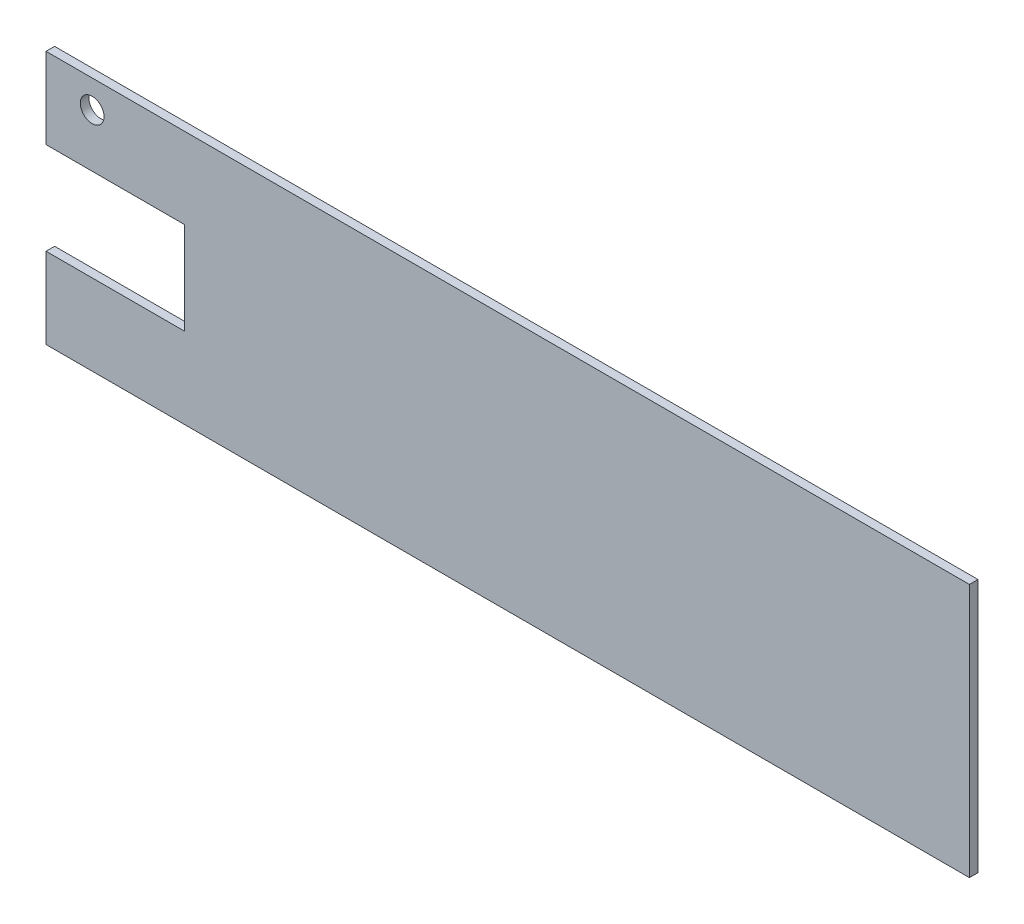
ISO-10303-21;
HEADER;
FILE_DESCRIPTION(('STEP AP214'),'2;1');
FILE_NAME('part.step','',(''),(''),'','','');
FILE_SCHEMA(('AUTOMOTIVE_DESIGN { 1 0 10303 214 1 1 1 1 }'));
ENDSEC;
DATA;
#1=APPLICATION_CONTEXT('core data for automotive mechanical design processes');
#2=APPLICATION_PROTOCOL_DEFINITION('international standard','automotive_design',2000,#1);
#3=PRODUCT_CONTEXT('',#1,'mechanical');
#4=PRODUCT('Part','Part','',(#3));
#5=PRODUCT_RELATED_PRODUCT_CATEGORY('part','',(#4));
#6=PRODUCT_DEFINITION_FORMATION('','',#4);
#7=PRODUCT_DEFINITION_CONTEXT('part definition',#1,'design');
#8=PRODUCT_DEFINITION('design','',#6,#7);
#9=PRODUCT_DEFINITION_SHAPE('','',#8);
#10=(LENGTH_UNIT() NAMED_UNIT(*) SI_UNIT(.MILLI.,.METRE.));
#11=(NAMED_UNIT(*) PLANE_ANGLE_UNIT() SI_UNIT($,.RADIAN.));
#12=(NAMED_UNIT(*) SI_UNIT($,.STERADIAN.) SOLID_ANGLE_UNIT());
#13=UNCERTAINTY_MEASURE_WITH_UNIT(LENGTH_MEASURE(1.E-05),#10,'distance_accuracy_value','');
#14=(GEOMETRIC_REPRESENTATION_CONTEXT(3) GLOBAL_UNCERTAINTY_ASSIGNED_CONTEXT((#13)) GLOBAL_UNIT_ASSIGNED_CONTEXT((#10,
#11,#12)) REPRESENTATION_CONTEXT('',''));
#15=CARTESIAN_POINT('',(0.,0.,0.));
#16=DIRECTION('',(0.,0.,1.));
#17=DIRECTION('',(1.,0.,0.));
#18=AXIS2_PLACEMENT_3D('',#15,#16,#17);
#19=CARTESIAN_POINT('',(0.,0.,2.3622));
#20=DIRECTION('',(1.,0.,0.));
#21=DIRECTION('',(0.,0.,-1.));
#22=AXIS2_PLACEMENT_3D('',#19,#20,#21);
#23=PLANE('',#22);
#24=DIRECTION('',(0.,-1.,0.));
#25=VECTOR('',#24,1.);
#26=CARTESIAN_POINT('',(0.,0.,0.));
#27=LINE('',#26,#25);
#28=CARTESIAN_POINT('',(0.,69.85,0.));
#29=VERTEX_POINT('',#28);
#30=CARTESIAN_POINT('',(0.,47.625,0.));
#31=VERTEX_POINT('',#30);
#32=EDGE_CURVE('E136',#29,#31,#27,.T.);
#33=ORIENTED_EDGE('',*,*,#32,.T.);
#34=DIRECTION('',(0.,0.,1.));
#35=VECTOR('',#34,1.);
#36=CARTESIAN_POINT('',(0.,47.625,0.));
#37=LINE('',#36,#35);
#38=CARTESIAN_POINT('',(0.,47.625,2.3622));
#39=VERTEX_POINT('',#38);
#40=EDGE_CURVE('E137',#31,#39,#37,.T.);
#41=ORIENTED_EDGE('',*,*,#40,.T.);
#42=DIRECTION('',(0.,-1.,0.));
#43=VECTOR('',#42,1.);
#44=CARTESIAN_POINT('',(0.,0.,2.3622));
#45=LINE('',#44,#43);
#46=CARTESIAN_POINT('',(0.,69.85,2.3622));
#47=VERTEX_POINT('',#46);
#48=EDGE_CURVE('E165',#47,#39,#45,.T.);
#49=ORIENTED_EDGE('',*,*,#48,.F.);
#50=DIRECTION('',(0.,0.,-1.));
#51=VECTOR('',#50,1.);
#52=CARTESIAN_POINT('',(0.,69.85,2.3622));
#53=LINE('',#52,#51);
#54=EDGE_CURVE('E150',#47,#29,#53,.T.);
#55=ORIENTED_EDGE('',*,*,#54,.T.);
#56=EDGE_LOOP('',(#33,#41,#49,#55));
#57=FACE_BOUND('',#56,.T.);
#58=ADVANCED_FACE('F42',(#57),#23,.F.);
#59=CARTESIAN_POINT('',(0.,22.225,2.3622));
#60=VERTEX_POINT('',#59);
#61=CARTESIAN_POINT('',(0.,0.,2.3622));
#62=VERTEX_POINT('',#61);
#63=EDGE_CURVE('E94',#60,#62,#45,.T.);
#64=ORIENTED_EDGE('',*,*,#63,.F.);
#65=DIRECTION('',(0.,0.,1.));
#66=VECTOR('',#65,1.);
#67=CARTESIAN_POINT('',(0.,22.225,0.));
#68=LINE('',#67,#66);
#69=CARTESIAN_POINT('',(0.,22.225,0.));
#70=VERTEX_POINT('',#69);
#71=EDGE_CURVE('E120',#70,#60,#68,.T.);
#72=ORIENTED_EDGE('',*,*,#71,.F.);
#73=CARTESIAN_POINT('',(0.,0.,0.));
#74=VERTEX_POINT('',#73);
#75=EDGE_CURVE('E128',#70,#74,#27,.T.);
#76=ORIENTED_EDGE('',*,*,#75,.T.);
#77=DIRECTION('',(0.,0.,-1.));
#78=VECTOR('',#77,1.);
#79=CARTESIAN_POINT('',(0.,0.,2.3622));
#80=LINE('',#79,#78);
#81=EDGE_CURVE('E11',#62,#74,#80,.T.);
#82=ORIENTED_EDGE('',*,*,#81,.F.);
#83=EDGE_LOOP('',(#64,#72,#76,#82));
#84=FACE_BOUND('',#83,.T.);
#85=ADVANCED_FACE('F44',(#84),#23,.F.);
#86=CARTESIAN_POINT('',(0.,0.,2.3622));
#87=DIRECTION('',(0.,1.,0.));
#88=DIRECTION('',(0.,0.,1.));
#89=AXIS2_PLACEMENT_3D('',#86,#87,#88);
#90=PLANE('',#89);
#91=DIRECTION('',(1.,0.,0.));
#92=VECTOR('',#91,1.);
#93=CARTESIAN_POINT('',(0.,0.,0.));
#94=LINE('',#93,#92);
#95=CARTESIAN_POINT('',(254.,0.,0.));
#96=VERTEX_POINT('',#95);
#97=EDGE_CURVE('E135',#74,#96,#94,.T.);
#98=ORIENTED_EDGE('',*,*,#97,.T.);
#99=DIRECTION('',(0.,0.,-1.));
#100=VECTOR('',#99,1.);
#101=CARTESIAN_POINT('',(254.,0.,2.3622));
#102=LINE('',#101,#100);
#103=CARTESIAN_POINT('',(254.,0.,2.3622));
#104=VERTEX_POINT('',#103);
#105=EDGE_CURVE('E50',#104,#96,#102,.T.);
#106=ORIENTED_EDGE('',*,*,#105,.F.);
#107=DIRECTION('',(1.,0.,0.));
#108=VECTOR('',#107,1.);
#109=CARTESIAN_POINT('',(0.,0.,2.3622));
#110=LINE('',#109,#108);
#111=EDGE_CURVE('E167',#62,#104,#110,.T.);
#112=ORIENTED_EDGE('',*,*,#111,.F.);
#113=ORIENTED_EDGE('',*,*,#81,.T.);
#114=EDGE_LOOP('',(#98,#106,#112,#113));
#115=FACE_BOUND('',#114,.T.);
#116=ADVANCED_FACE('F215',(#115),#90,.F.);
#117=CARTESIAN_POINT('',(254.,0.,2.3622));
#118=DIRECTION('',(-1.,0.,0.));
#119=DIRECTION('',(0.,0.,1.));
#120=AXIS2_PLACEMENT_3D('',#117,#118,#119);
#121=PLANE('',#120);
#122=DIRECTION('',(0.,1.,0.));
#123=VECTOR('',#122,1.);
#124=CARTESIAN_POINT('',(254.,0.,0.));
#125=LINE('',#124,#123);
#126=CARTESIAN_POINT('',(254.,69.85,0.));
#127=VERTEX_POINT('',#126);
#128=EDGE_CURVE('E147',#96,#127,#125,.T.);
#129=ORIENTED_EDGE('',*,*,#128,.T.);
#130=DIRECTION('',(0.,0.,-1.));
#131=VECTOR('',#130,1.);
#132=CARTESIAN_POINT('',(254.,69.85,2.3622));
#133=LINE('',#132,#131);
#134=CARTESIAN_POINT('',(254.,69.85,2.3622));
#135=VERTEX_POINT('',#134);
#136=EDGE_CURVE('E152',#135,#127,#133,.T.);
#137=ORIENTED_EDGE('',*,*,#136,.F.);
#138=DIRECTION('',(0.,1.,0.));
#139=VECTOR('',#138,1.);
#140=CARTESIAN_POINT('',(254.,0.,2.3622));
#141=LINE('',#140,#139);
#142=EDGE_CURVE('E159',#104,#135,#141,.T.);
#143=ORIENTED_EDGE('',*,*,#142,.F.);
#144=ORIENTED_EDGE('',*,*,#105,.T.);
#145=EDGE_LOOP('',(#129,#137,#143,#144));
#146=FACE_BOUND('',#145,.T.);
#147=ADVANCED_FACE('F157',(#146),#121,.F.);
#148=CARTESIAN_POINT('',(0.,69.85,2.3622));
#149=DIRECTION('',(0.,-1.,0.));
#150=DIRECTION('',(0.,0.,-1.));
#151=AXIS2_PLACEMENT_3D('',#148,#149,#150);
#152=PLANE('',#151);
#153=DIRECTION('',(-1.,0.,0.));
#154=VECTOR('',#153,1.);
#155=CARTESIAN_POINT('',(0.,69.85,0.));
#156=LINE('',#155,#154);
#157=EDGE_CURVE('E87',#127,#29,#156,.T.);
#158=ORIENTED_EDGE('',*,*,#157,.T.);
#159=ORIENTED_EDGE('',*,*,#54,.F.);
#160=DIRECTION('',(-1.,0.,0.));
#161=VECTOR('',#160,1.);
#162=CARTESIAN_POINT('',(0.,69.85,2.3622));
#163=LINE('',#162,#161);
#164=EDGE_CURVE('E66',#135,#47,#163,.T.);
#165=ORIENTED_EDGE('',*,*,#164,.F.);
#166=ORIENTED_EDGE('',*,*,#136,.T.);
#167=EDGE_LOOP('',(#158,#159,#165,#166));
#168=FACE_BOUND('',#167,.T.);
#169=ADVANCED_FACE('F166',(#168),#152,.F.);
#170=CARTESIAN_POINT('',(0.,0.,2.3622));
#171=DIRECTION('',(0.,0.,-1.));
#172=DIRECTION('',(-1.,0.,0.));
#173=AXIS2_PLACEMENT_3D('',#170,#171,#172);
#174=PLANE('',#173);
#175=CARTESIAN_POINT('',(12.7,62.23,2.3622));
#176=DIRECTION('',(0.,0.,1.));
#177=DIRECTION('',(1.,0.,0.));
#178=AXIS2_PLACEMENT_3D('',#175,#176,#177);
#179=CIRCLE('',#178,3.2639);
#180=CARTESIAN_POINT('',(15.9639,62.23,2.3622));
#181=VERTEX_POINT('',#180);
#182=EDGE_CURVE('E182',#181,#181,#179,.T.);
#183=ORIENTED_EDGE('',*,*,#182,.F.);
#184=EDGE_LOOP('',(#183));
#185=FACE_BOUND('',#184,.T.);
#186=ORIENTED_EDGE('',*,*,#48,.T.);
#187=DIRECTION('',(-1.,0.,0.));
#188=VECTOR('',#187,1.);
#189=CARTESIAN_POINT('',(0.,47.625,2.3622));
#190=LINE('',#189,#188);
#191=CARTESIAN_POINT('',(38.1,47.625,2.3622));
#192=VERTEX_POINT('',#191);
#193=EDGE_CURVE('E124',#192,#39,#190,.T.);
#194=ORIENTED_EDGE('',*,*,#193,.F.);
#195=DIRECTION('',(0.,1.,0.));
#196=VECTOR('',#195,1.);
#197=CARTESIAN_POINT('',(38.1,47.625,2.3622));
#198=LINE('',#197,#196);
#199=CARTESIAN_POINT('',(38.1,22.225,2.3622));
#200=VERTEX_POINT('',#199);
#201=EDGE_CURVE('E174',#200,#192,#198,.T.);
#202=ORIENTED_EDGE('',*,*,#201,.F.);
#203=DIRECTION('',(1.,0.,0.));
#204=VECTOR('',#203,1.);
#205=CARTESIAN_POINT('',(0.,22.225,2.3622));
#206=LINE('',#205,#204);
#207=EDGE_CURVE('E177',#60,#200,#206,.T.);
#208=ORIENTED_EDGE('',*,*,#207,.F.);
#209=ORIENTED_EDGE('',*,*,#63,.T.);
#210=ORIENTED_EDGE('',*,*,#111,.T.);
#211=ORIENTED_EDGE('',*,*,#142,.T.);
#212=ORIENTED_EDGE('',*,*,#164,.T.);
#213=EDGE_LOOP('',(#186,#194,#202,#208,#209,#210,#211,#212));
#214=FACE_BOUND('',#213,.T.);
#215=ADVANCED_FACE('F195',(#185,#214),#174,.F.);
#216=CARTESIAN_POINT('',(0.,0.,0.));
#217=DIRECTION('',(0.,0.,-1.));
#218=DIRECTION('',(-1.,0.,0.));
#219=AXIS2_PLACEMENT_3D('',#216,#217,#218);
#220=PLANE('',#219);
#221=CARTESIAN_POINT('',(12.7,62.23,0.));
#222=DIRECTION('',(0.,0.,1.));
#223=DIRECTION('',(1.,0.,0.));
#224=AXIS2_PLACEMENT_3D('',#221,#222,#223);
#225=CIRCLE('',#224,3.2639);
#226=CARTESIAN_POINT('',(15.9639,62.23,0.));
#227=VERTEX_POINT('',#226);
#228=EDGE_CURVE('E179',#227,#227,#225,.T.);
#229=ORIENTED_EDGE('',*,*,#228,.T.);
#230=EDGE_LOOP('',(#229));
#231=FACE_BOUND('',#230,.T.);
#232=DIRECTION('',(-1.,0.,0.));
#233=VECTOR('',#232,1.);
#234=CARTESIAN_POINT('',(0.,47.625,0.));
#235=LINE('',#234,#233);
#236=CARTESIAN_POINT('',(38.1,47.625,0.));
#237=VERTEX_POINT('',#236);
#238=EDGE_CURVE('E130',#237,#31,#235,.T.);
#239=ORIENTED_EDGE('',*,*,#238,.T.);
#240=ORIENTED_EDGE('',*,*,#32,.F.);
#241=ORIENTED_EDGE('',*,*,#157,.F.);
#242=ORIENTED_EDGE('',*,*,#128,.F.);
#243=ORIENTED_EDGE('',*,*,#97,.F.);
#244=ORIENTED_EDGE('',*,*,#75,.F.);
#245=DIRECTION('',(1.,0.,0.));
#246=VECTOR('',#245,1.);
#247=CARTESIAN_POINT('',(0.,22.225,0.));
#248=LINE('',#247,#246);
#249=CARTESIAN_POINT('',(38.1,22.225,0.));
#250=VERTEX_POINT('',#249);
#251=EDGE_CURVE('E116',#70,#250,#248,.T.);
#252=ORIENTED_EDGE('',*,*,#251,.T.);
#253=DIRECTION('',(0.,1.,0.));
#254=VECTOR('',#253,1.);
#255=CARTESIAN_POINT('',(38.1,47.625,0.));
#256=LINE('',#255,#254);
#257=EDGE_CURVE('E57',#250,#237,#256,.T.);
#258=ORIENTED_EDGE('',*,*,#257,.T.);
#259=EDGE_LOOP('',(#239,#240,#241,#242,#243,#244,#252,#258));
#260=FACE_BOUND('',#259,.T.);
#261=ADVANCED_FACE('F133',(#231,#260),#220,.T.);
#262=CARTESIAN_POINT('',(0.,47.625,0.));
#263=DIRECTION('',(0.,1.,0.));
#264=DIRECTION('',(0.,0.,1.));
#265=AXIS2_PLACEMENT_3D('',#262,#263,#264);
#266=PLANE('',#265);
#267=ORIENTED_EDGE('',*,*,#193,.T.);
#268=ORIENTED_EDGE('',*,*,#40,.F.);
#269=ORIENTED_EDGE('',*,*,#238,.F.);
#270=DIRECTION('',(0.,0.,1.));
#271=VECTOR('',#270,1.);
#272=CARTESIAN_POINT('',(38.1,47.625,0.));
#273=LINE('',#272,#271);
#274=EDGE_CURVE('E141',#237,#192,#273,.T.);
#275=ORIENTED_EDGE('',*,*,#274,.T.);
#276=EDGE_LOOP('',(#267,#268,#269,#275));
#277=FACE_BOUND('',#276,.T.);
#278=ADVANCED_FACE('F201',(#277),#266,.F.);
#279=CARTESIAN_POINT('',(38.1,47.625,0.));
#280=DIRECTION('',(1.,0.,0.));
#281=DIRECTION('',(0.,0.,-1.));
#282=AXIS2_PLACEMENT_3D('',#279,#280,#281);
#283=PLANE('',#282);
#284=ORIENTED_EDGE('',*,*,#201,.T.);
#285=ORIENTED_EDGE('',*,*,#274,.F.);
#286=ORIENTED_EDGE('',*,*,#257,.F.);
#287=DIRECTION('',(0.,0.,1.));
#288=VECTOR('',#287,1.);
#289=CARTESIAN_POINT('',(38.1,22.225,0.));
#290=LINE('',#289,#288);
#291=EDGE_CURVE('E121',#250,#200,#290,.T.);
#292=ORIENTED_EDGE('',*,*,#291,.T.);
#293=EDGE_LOOP('',(#284,#285,#286,#292));
#294=FACE_BOUND('',#293,.T.);
#295=ADVANCED_FACE('F202',(#294),#283,.F.);
#296=CARTESIAN_POINT('',(0.,22.225,0.));
#297=DIRECTION('',(0.,-1.,0.));
#298=DIRECTION('',(0.,0.,-1.));
#299=AXIS2_PLACEMENT_3D('',#296,#297,#298);
#300=PLANE('',#299);
#301=ORIENTED_EDGE('',*,*,#207,.T.);
#302=ORIENTED_EDGE('',*,*,#291,.F.);
#303=ORIENTED_EDGE('',*,*,#251,.F.);
#304=ORIENTED_EDGE('',*,*,#71,.T.);
#305=EDGE_LOOP('',(#301,#302,#303,#304));
#306=FACE_BOUND('',#305,.T.);
#307=ADVANCED_FACE('F119',(#306),#300,.F.);
#308=CARTESIAN_POINT('',(12.7,62.23,0.));
#309=DIRECTION('',(0.,0.,1.));
#310=DIRECTION('',(1.,0.,0.));
#311=AXIS2_PLACEMENT_3D('',#308,#309,#310);
#312=CYLINDRICAL_SURFACE('',#311,3.2639);
#313=ORIENTED_EDGE('',*,*,#228,.F.);
#314=EDGE_LOOP('',(#313));
#315=FACE_BOUND('',#314,.T.);
#316=ORIENTED_EDGE('',*,*,#182,.T.);
#317=EDGE_LOOP('',(#316));
#318=FACE_BOUND('',#317,.T.);
#319=ADVANCED_FACE('F189',(#315,#318),#312,.F.);
#320=CLOSED_SHELL('',(#58,#85,#116,#147,#169,#215,#261,#278,#295,#307,#319));
#321=MANIFOLD_SOLID_BREP('B2',#320);
#322=ADVANCED_BREP_SHAPE_REPRESENTATION('',(#18,#321),#14);
#323=SHAPE_DEFINITION_REPRESENTATION(#9,#322);
ENDSEC;
END-ISO-10303-21;
